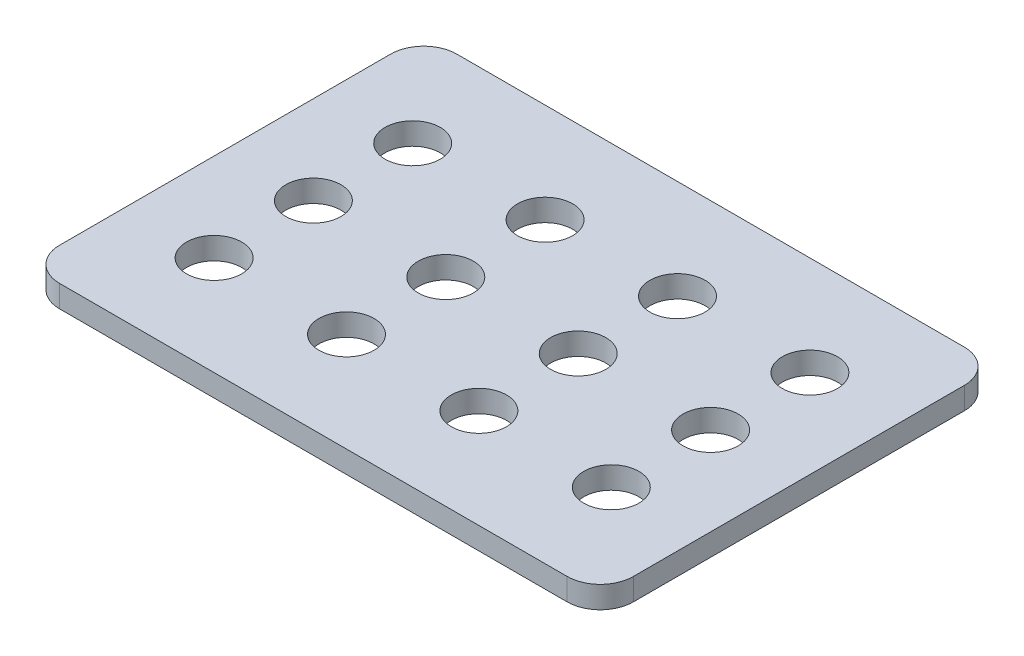
ISO-10303-21;
HEADER;
FILE_DESCRIPTION(('STEP AP214'),'2;1');
FILE_NAME('part.step','',(''),(''),'','','');
FILE_SCHEMA(('AUTOMOTIVE_DESIGN { 1 0 10303 214 1 1 1 1 }'));
ENDSEC;
DATA;
#1=APPLICATION_CONTEXT('core data for automotive mechanical design processes');
#2=APPLICATION_PROTOCOL_DEFINITION('international standard','automotive_design',2000,#1);
#3=PRODUCT_CONTEXT('',#1,'mechanical');
#4=PRODUCT('Part','Part','',(#3));
#5=PRODUCT_RELATED_PRODUCT_CATEGORY('part','',(#4));
#6=PRODUCT_DEFINITION_FORMATION('','',#4);
#7=PRODUCT_DEFINITION_CONTEXT('part definition',#1,'design');
#8=PRODUCT_DEFINITION('design','',#6,#7);
#9=PRODUCT_DEFINITION_SHAPE('','',#8);
#10=(LENGTH_UNIT() NAMED_UNIT(*) SI_UNIT(.MILLI.,.METRE.));
#11=(NAMED_UNIT(*) PLANE_ANGLE_UNIT() SI_UNIT($,.RADIAN.));
#12=(NAMED_UNIT(*) SI_UNIT($,.STERADIAN.) SOLID_ANGLE_UNIT());
#13=UNCERTAINTY_MEASURE_WITH_UNIT(LENGTH_MEASURE(1.E-05),#10,'distance_accuracy_value','');
#14=(GEOMETRIC_REPRESENTATION_CONTEXT(3) GLOBAL_UNCERTAINTY_ASSIGNED_CONTEXT((#13)) GLOBAL_UNIT_ASSIGNED_CONTEXT((#10,
#11,#12)) REPRESENTATION_CONTEXT('',''));
#15=CARTESIAN_POINT('',(0.,0.,0.));
#16=DIRECTION('',(0.,0.,1.));
#17=DIRECTION('',(1.,0.,0.));
#18=AXIS2_PLACEMENT_3D('',#15,#16,#17);
#19=CARTESIAN_POINT('',(15.,-10.,-15.));
#20=DIRECTION('',(0.,1.,0.));
#21=DIRECTION('',(0.,0.,1.));
#22=AXIS2_PLACEMENT_3D('',#19,#20,#21);
#23=CYLINDRICAL_SURFACE('',#22,15.);
#24=CARTESIAN_POINT('',(15.,0.,-15.));
#25=DIRECTION('',(0.,1.,0.));
#26=DIRECTION('',(0.,0.,-1.));
#27=AXIS2_PLACEMENT_3D('',#24,#25,#26);
#28=CIRCLE('',#27,15.);
#29=CARTESIAN_POINT('',(0.,0.,-15.0000000000001));
#30=VERTEX_POINT('',#29);
#31=CARTESIAN_POINT('',(15.0000000000001,0.,0.));
#32=VERTEX_POINT('',#31);
#33=EDGE_CURVE('E138',#30,#32,#28,.T.);
#34=ORIENTED_EDGE('',*,*,#33,.F.);
#35=DIRECTION('',(0.,1.,0.));
#36=VECTOR('',#35,1.);
#37=CARTESIAN_POINT('',(0.,-10.,-15.0000000000001));
#38=LINE('',#37,#36);
#39=CARTESIAN_POINT('',(0.,-10.,-15.0000000000001));
#40=VERTEX_POINT('',#39);
#41=EDGE_CURVE('E11',#40,#30,#38,.T.);
#42=ORIENTED_EDGE('',*,*,#41,.F.);
#43=CARTESIAN_POINT('',(15.,-10.,-15.));
#44=DIRECTION('',(0.,1.,0.));
#45=DIRECTION('',(0.,0.,-1.));
#46=AXIS2_PLACEMENT_3D('',#43,#44,#45);
#47=CIRCLE('',#46,15.);
#48=CARTESIAN_POINT('',(15.0000000000001,-10.,0.));
#49=VERTEX_POINT('',#48);
#50=EDGE_CURVE('E159',#40,#49,#47,.T.);
#51=ORIENTED_EDGE('',*,*,#50,.T.);
#52=DIRECTION('',(0.,1.,0.));
#53=VECTOR('',#52,1.);
#54=CARTESIAN_POINT('',(15.0000000000001,-10.,0.));
#55=LINE('',#54,#53);
#56=EDGE_CURVE('E42',#49,#32,#55,.T.);
#57=ORIENTED_EDGE('',*,*,#56,.T.);
#58=EDGE_LOOP('',(#34,#42,#51,#57));
#59=FACE_BOUND('',#58,.T.);
#60=ADVANCED_FACE('F41',(#59),#23,.T.);
#61=CARTESIAN_POINT('',(0.,-10.,-15.0000000000001));
#62=DIRECTION('',(-1.,0.,0.));
#63=DIRECTION('',(0.,0.,1.));
#64=AXIS2_PLACEMENT_3D('',#61,#62,#63);
#65=PLANE('',#64);
#66=DIRECTION('',(0.,0.,1.));
#67=VECTOR('',#66,1.);
#68=CARTESIAN_POINT('',(0.,0.,-15.0000000000001));
#69=LINE('',#68,#67);
#70=CARTESIAN_POINT('',(0.,0.,-165.));
#71=VERTEX_POINT('',#70);
#72=EDGE_CURVE('E160',#71,#30,#69,.T.);
#73=ORIENTED_EDGE('',*,*,#72,.F.);
#74=DIRECTION('',(0.,1.,0.));
#75=VECTOR('',#74,1.);
#76=CARTESIAN_POINT('',(0.,-10.,-165.));
#77=LINE('',#76,#75);
#78=CARTESIAN_POINT('',(0.,-10.,-165.));
#79=VERTEX_POINT('',#78);
#80=EDGE_CURVE('E49',#79,#71,#77,.T.);
#81=ORIENTED_EDGE('',*,*,#80,.F.);
#82=DIRECTION('',(0.,0.,1.));
#83=VECTOR('',#82,1.);
#84=CARTESIAN_POINT('',(0.,-10.,-15.0000000000001));
#85=LINE('',#84,#83);
#86=EDGE_CURVE('E126',#79,#40,#85,.T.);
#87=ORIENTED_EDGE('',*,*,#86,.T.);
#88=ORIENTED_EDGE('',*,*,#41,.T.);
#89=EDGE_LOOP('',(#73,#81,#87,#88));
#90=FACE_BOUND('',#89,.T.);
#91=ADVANCED_FACE('F173',(#90),#65,.T.);
#92=CARTESIAN_POINT('',(15.,-10.,-165.));
#93=DIRECTION('',(0.,1.,0.));
#94=DIRECTION('',(0.,0.,1.));
#95=AXIS2_PLACEMENT_3D('',#92,#93,#94);
#96=CYLINDRICAL_SURFACE('',#95,15.);
#97=CARTESIAN_POINT('',(15.,0.,-165.));
#98=DIRECTION('',(0.,1.,0.));
#99=DIRECTION('',(0.,0.,-1.));
#100=AXIS2_PLACEMENT_3D('',#97,#98,#99);
#101=CIRCLE('',#100,15.);
#102=CARTESIAN_POINT('',(15.0000000000001,0.,-180.));
#103=VERTEX_POINT('',#102);
#104=EDGE_CURVE('E113',#103,#71,#101,.T.);
#105=ORIENTED_EDGE('',*,*,#104,.F.);
#106=DIRECTION('',(0.,1.,0.));
#107=VECTOR('',#106,1.);
#108=CARTESIAN_POINT('',(15.0000000000001,-10.,-180.));
#109=LINE('',#108,#107);
#110=CARTESIAN_POINT('',(15.0000000000001,-10.,-180.));
#111=VERTEX_POINT('',#110);
#112=EDGE_CURVE('E110',#111,#103,#109,.T.);
#113=ORIENTED_EDGE('',*,*,#112,.F.);
#114=CARTESIAN_POINT('',(15.,-10.,-165.));
#115=DIRECTION('',(0.,1.,0.));
#116=DIRECTION('',(0.,0.,-1.));
#117=AXIS2_PLACEMENT_3D('',#114,#115,#116);
#118=CIRCLE('',#117,15.);
#119=EDGE_CURVE('E111',#111,#79,#118,.T.);
#120=ORIENTED_EDGE('',*,*,#119,.T.);
#121=ORIENTED_EDGE('',*,*,#80,.T.);
#122=EDGE_LOOP('',(#105,#113,#120,#121));
#123=FACE_BOUND('',#122,.T.);
#124=ADVANCED_FACE('F115',(#123),#96,.T.);
#125=CARTESIAN_POINT('',(15.0000000000001,-10.,-180.));
#126=DIRECTION('',(0.,0.,-1.));
#127=DIRECTION('',(-1.,0.,0.));
#128=AXIS2_PLACEMENT_3D('',#125,#126,#127);
#129=PLANE('',#128);
#130=DIRECTION('',(-1.,0.,0.));
#131=VECTOR('',#130,1.);
#132=CARTESIAN_POINT('',(15.0000000000001,0.,-180.));
#133=LINE('',#132,#131);
#134=CARTESIAN_POINT('',(245.,0.,-180.));
#135=VERTEX_POINT('',#134);
#136=EDGE_CURVE('E153',#135,#103,#133,.T.);
#137=ORIENTED_EDGE('',*,*,#136,.F.);
#138=DIRECTION('',(0.,1.,0.));
#139=VECTOR('',#138,1.);
#140=CARTESIAN_POINT('',(245.,-10.,-180.));
#141=LINE('',#140,#139);
#142=CARTESIAN_POINT('',(245.,-10.,-180.));
#143=VERTEX_POINT('',#142);
#144=EDGE_CURVE('E120',#143,#135,#141,.T.);
#145=ORIENTED_EDGE('',*,*,#144,.F.);
#146=DIRECTION('',(-1.,0.,0.));
#147=VECTOR('',#146,1.);
#148=CARTESIAN_POINT('',(15.0000000000001,-10.,-180.));
#149=LINE('',#148,#147);
#150=EDGE_CURVE('E128',#143,#111,#149,.T.);
#151=ORIENTED_EDGE('',*,*,#150,.T.);
#152=ORIENTED_EDGE('',*,*,#112,.T.);
#153=EDGE_LOOP('',(#137,#145,#151,#152));
#154=FACE_BOUND('',#153,.T.);
#155=ADVANCED_FACE('F127',(#154),#129,.T.);
#156=CARTESIAN_POINT('',(245.,-10.,-165.));
#157=DIRECTION('',(0.,1.,0.));
#158=DIRECTION('',(0.,0.,1.));
#159=AXIS2_PLACEMENT_3D('',#156,#157,#158);
#160=CYLINDRICAL_SURFACE('',#159,15.);
#161=CARTESIAN_POINT('',(245.,0.,-165.));
#162=DIRECTION('',(0.,1.,0.));
#163=DIRECTION('',(0.,0.,1.));
#164=AXIS2_PLACEMENT_3D('',#161,#162,#163);
#165=CIRCLE('',#164,15.);
#166=CARTESIAN_POINT('',(260.,0.,-165.));
#167=VERTEX_POINT('',#166);
#168=EDGE_CURVE('E151',#167,#135,#165,.T.);
#169=ORIENTED_EDGE('',*,*,#168,.F.);
#170=DIRECTION('',(0.,1.,0.));
#171=VECTOR('',#170,1.);
#172=CARTESIAN_POINT('',(260.,-10.,-165.));
#173=LINE('',#172,#171);
#174=CARTESIAN_POINT('',(260.,-10.,-165.));
#175=VERTEX_POINT('',#174);
#176=EDGE_CURVE('E164',#175,#167,#173,.T.);
#177=ORIENTED_EDGE('',*,*,#176,.F.);
#178=CARTESIAN_POINT('',(245.,-10.,-165.));
#179=DIRECTION('',(0.,1.,0.));
#180=DIRECTION('',(0.,0.,1.));
#181=AXIS2_PLACEMENT_3D('',#178,#179,#180);
#182=CIRCLE('',#181,15.);
#183=EDGE_CURVE('E131',#175,#143,#182,.T.);
#184=ORIENTED_EDGE('',*,*,#183,.T.);
#185=ORIENTED_EDGE('',*,*,#144,.T.);
#186=EDGE_LOOP('',(#169,#177,#184,#185));
#187=FACE_BOUND('',#186,.T.);
#188=ADVANCED_FACE('F182',(#187),#160,.T.);
#189=CARTESIAN_POINT('',(260.,-10.,-15.0000000000001));
#190=DIRECTION('',(1.,0.,0.));
#191=DIRECTION('',(0.,0.,-1.));
#192=AXIS2_PLACEMENT_3D('',#189,#190,#191);
#193=PLANE('',#192);
#194=DIRECTION('',(0.,0.,-1.));
#195=VECTOR('',#194,1.);
#196=CARTESIAN_POINT('',(260.,0.,-15.0000000000001));
#197=LINE('',#196,#195);
#198=CARTESIAN_POINT('',(260.,0.,-15.0000000000001));
#199=VERTEX_POINT('',#198);
#200=EDGE_CURVE('E149',#199,#167,#197,.T.);
#201=ORIENTED_EDGE('',*,*,#200,.F.);
#202=DIRECTION('',(0.,1.,0.));
#203=VECTOR('',#202,1.);
#204=CARTESIAN_POINT('',(260.,-10.,-15.0000000000001));
#205=LINE('',#204,#203);
#206=CARTESIAN_POINT('',(260.,-10.,-15.0000000000001));
#207=VERTEX_POINT('',#206);
#208=EDGE_CURVE('E165',#207,#199,#205,.T.);
#209=ORIENTED_EDGE('',*,*,#208,.F.);
#210=DIRECTION('',(0.,0.,-1.));
#211=VECTOR('',#210,1.);
#212=CARTESIAN_POINT('',(260.,-10.,-15.0000000000001));
#213=LINE('',#212,#211);
#214=EDGE_CURVE('E133',#207,#175,#213,.T.);
#215=ORIENTED_EDGE('',*,*,#214,.T.);
#216=ORIENTED_EDGE('',*,*,#176,.T.);
#217=EDGE_LOOP('',(#201,#209,#215,#216));
#218=FACE_BOUND('',#217,.T.);
#219=ADVANCED_FACE('F190',(#218),#193,.T.);
#220=CARTESIAN_POINT('',(245.,-10.,-15.));
#221=DIRECTION('',(0.,1.,0.));
#222=DIRECTION('',(0.,0.,1.));
#223=AXIS2_PLACEMENT_3D('',#220,#221,#222);
#224=CYLINDRICAL_SURFACE('',#223,15.);
#225=CARTESIAN_POINT('',(245.,0.,-15.));
#226=DIRECTION('',(0.,1.,0.));
#227=DIRECTION('',(0.,0.,1.));
#228=AXIS2_PLACEMENT_3D('',#225,#226,#227);
#229=CIRCLE('',#228,15.);
#230=CARTESIAN_POINT('',(245.,0.,0.));
#231=VERTEX_POINT('',#230);
#232=EDGE_CURVE('E144',#231,#199,#229,.T.);
#233=ORIENTED_EDGE('',*,*,#232,.F.);
#234=DIRECTION('',(0.,1.,0.));
#235=VECTOR('',#234,1.);
#236=CARTESIAN_POINT('',(245.,-10.,0.));
#237=LINE('',#236,#235);
#238=CARTESIAN_POINT('',(245.,-10.,0.));
#239=VERTEX_POINT('',#238);
#240=EDGE_CURVE('E168',#239,#231,#237,.T.);
#241=ORIENTED_EDGE('',*,*,#240,.F.);
#242=CARTESIAN_POINT('',(245.,-10.,-15.));
#243=DIRECTION('',(0.,1.,0.));
#244=DIRECTION('',(0.,0.,1.));
#245=AXIS2_PLACEMENT_3D('',#242,#243,#244);
#246=CIRCLE('',#245,15.);
#247=EDGE_CURVE('E334',#239,#207,#246,.T.);
#248=ORIENTED_EDGE('',*,*,#247,.T.);
#249=ORIENTED_EDGE('',*,*,#208,.T.);
#250=EDGE_LOOP('',(#233,#241,#248,#249));
#251=FACE_BOUND('',#250,.T.);
#252=ADVANCED_FACE('F192',(#251),#224,.T.);
#253=CARTESIAN_POINT('',(15.0000000000001,-10.,0.));
#254=DIRECTION('',(0.,0.,1.));
#255=DIRECTION('',(1.,0.,0.));
#256=AXIS2_PLACEMENT_3D('',#253,#254,#255);
#257=PLANE('',#256);
#258=DIRECTION('',(1.,0.,0.));
#259=VECTOR('',#258,1.);
#260=CARTESIAN_POINT('',(15.0000000000001,0.,0.));
#261=LINE('',#260,#259);
#262=EDGE_CURVE('E141',#32,#231,#261,.T.);
#263=ORIENTED_EDGE('',*,*,#262,.F.);
#264=ORIENTED_EDGE('',*,*,#56,.F.);
#265=DIRECTION('',(1.,0.,0.));
#266=VECTOR('',#265,1.);
#267=CARTESIAN_POINT('',(15.0000000000001,-10.,0.));
#268=LINE('',#267,#266);
#269=EDGE_CURVE('E331',#49,#239,#268,.T.);
#270=ORIENTED_EDGE('',*,*,#269,.T.);
#271=ORIENTED_EDGE('',*,*,#240,.T.);
#272=EDGE_LOOP('',(#263,#264,#270,#271));
#273=FACE_BOUND('',#272,.T.);
#274=ADVANCED_FACE('F166',(#273),#257,.T.);
#275=CARTESIAN_POINT('',(15.,-10.,-15.));
#276=DIRECTION('',(0.,-1.,0.));
#277=DIRECTION('',(0.,0.,-1.));
#278=AXIS2_PLACEMENT_3D('',#275,#276,#277);
#279=PLANE('',#278);
#280=CARTESIAN_POINT('',(220.,-10.,-135.));
#281=DIRECTION('',(0.,1.,0.));
#282=DIRECTION('',(0.,0.,1.));
#283=AXIS2_PLACEMENT_3D('',#280,#281,#282);
#284=CIRCLE('',#283,12.5);
#285=CARTESIAN_POINT('',(220.,-10.,-122.5));
#286=VERTEX_POINT('',#285);
#287=EDGE_CURVE('E256',#286,#286,#284,.T.);
#288=ORIENTED_EDGE('',*,*,#287,.T.);
#289=EDGE_LOOP('',(#288));
#290=FACE_BOUND('',#289,.T.);
#291=CARTESIAN_POINT('',(220.,-10.,-90.));
#292=DIRECTION('',(0.,1.,0.));
#293=DIRECTION('',(0.,0.,1.));
#294=AXIS2_PLACEMENT_3D('',#291,#292,#293);
#295=CIRCLE('',#294,12.5);
#296=CARTESIAN_POINT('',(220.,-10.,-77.5));
#297=VERTEX_POINT('',#296);
#298=EDGE_CURVE('E266',#297,#297,#295,.T.);
#299=ORIENTED_EDGE('',*,*,#298,.T.);
#300=EDGE_LOOP('',(#299));
#301=FACE_BOUND('',#300,.T.);
#302=CARTESIAN_POINT('',(220.,-10.,-45.));
#303=DIRECTION('',(0.,1.,0.));
#304=DIRECTION('',(0.,0.,1.));
#305=AXIS2_PLACEMENT_3D('',#302,#303,#304);
#306=CIRCLE('',#305,12.5);
#307=CARTESIAN_POINT('',(220.,-10.,-32.5));
#308=VERTEX_POINT('',#307);
#309=EDGE_CURVE('E275',#308,#308,#306,.T.);
#310=ORIENTED_EDGE('',*,*,#309,.T.);
#311=EDGE_LOOP('',(#310));
#312=FACE_BOUND('',#311,.T.);
#313=CARTESIAN_POINT('',(160.,-10.,-135.));
#314=DIRECTION('',(0.,1.,0.));
#315=DIRECTION('',(0.,0.,1.));
#316=AXIS2_PLACEMENT_3D('',#313,#314,#315);
#317=CIRCLE('',#316,12.5);
#318=CARTESIAN_POINT('',(160.,-10.,-122.5));
#319=VERTEX_POINT('',#318);
#320=EDGE_CURVE('E277',#319,#319,#317,.T.);
#321=ORIENTED_EDGE('',*,*,#320,.T.);
#322=EDGE_LOOP('',(#321));
#323=FACE_BOUND('',#322,.T.);
#324=CARTESIAN_POINT('',(160.,-10.,-90.));
#325=DIRECTION('',(0.,1.,0.));
#326=DIRECTION('',(0.,0.,1.));
#327=AXIS2_PLACEMENT_3D('',#324,#325,#326);
#328=CIRCLE('',#327,12.5);
#329=CARTESIAN_POINT('',(160.,-10.,-77.5));
#330=VERTEX_POINT('',#329);
#331=EDGE_CURVE('E281',#330,#330,#328,.T.);
#332=ORIENTED_EDGE('',*,*,#331,.T.);
#333=EDGE_LOOP('',(#332));
#334=FACE_BOUND('',#333,.T.);
#335=CARTESIAN_POINT('',(160.,-10.,-45.));
#336=DIRECTION('',(0.,1.,0.));
#337=DIRECTION('',(0.,0.,1.));
#338=AXIS2_PLACEMENT_3D('',#335,#336,#337);
#339=CIRCLE('',#338,12.5);
#340=CARTESIAN_POINT('',(160.,-10.,-32.5));
#341=VERTEX_POINT('',#340);
#342=EDGE_CURVE('E290',#341,#341,#339,.T.);
#343=ORIENTED_EDGE('',*,*,#342,.T.);
#344=EDGE_LOOP('',(#343));
#345=FACE_BOUND('',#344,.T.);
#346=CARTESIAN_POINT('',(100.,-10.,-135.));
#347=DIRECTION('',(0.,1.,0.));
#348=DIRECTION('',(0.,0.,1.));
#349=AXIS2_PLACEMENT_3D('',#346,#347,#348);
#350=CIRCLE('',#349,12.5);
#351=CARTESIAN_POINT('',(100.,-10.,-122.5));
#352=VERTEX_POINT('',#351);
#353=EDGE_CURVE('E296',#352,#352,#350,.T.);
#354=ORIENTED_EDGE('',*,*,#353,.T.);
#355=EDGE_LOOP('',(#354));
#356=FACE_BOUND('',#355,.T.);
#357=CARTESIAN_POINT('',(100.,-10.,-90.));
#358=DIRECTION('',(0.,1.,0.));
#359=DIRECTION('',(0.,0.,1.));
#360=AXIS2_PLACEMENT_3D('',#357,#358,#359);
#361=CIRCLE('',#360,12.5);
#362=CARTESIAN_POINT('',(100.,-10.,-77.5));
#363=VERTEX_POINT('',#362);
#364=EDGE_CURVE('E302',#363,#363,#361,.T.);
#365=ORIENTED_EDGE('',*,*,#364,.T.);
#366=EDGE_LOOP('',(#365));
#367=FACE_BOUND('',#366,.T.);
#368=CARTESIAN_POINT('',(100.,-10.,-45.));
#369=DIRECTION('',(0.,1.,0.));
#370=DIRECTION('',(0.,0.,1.));
#371=AXIS2_PLACEMENT_3D('',#368,#369,#370);
#372=CIRCLE('',#371,12.5);
#373=CARTESIAN_POINT('',(100.,-10.,-32.5));
#374=VERTEX_POINT('',#373);
#375=EDGE_CURVE('E306',#374,#374,#372,.T.);
#376=ORIENTED_EDGE('',*,*,#375,.T.);
#377=EDGE_LOOP('',(#376));
#378=FACE_BOUND('',#377,.T.);
#379=CARTESIAN_POINT('',(40.,-10.,-135.));
#380=DIRECTION('',(0.,1.,0.));
#381=DIRECTION('',(0.,0.,1.));
#382=AXIS2_PLACEMENT_3D('',#379,#380,#381);
#383=CIRCLE('',#382,12.5);
#384=CARTESIAN_POINT('',(40.,-10.,-122.5));
#385=VERTEX_POINT('',#384);
#386=EDGE_CURVE('E312',#385,#385,#383,.T.);
#387=ORIENTED_EDGE('',*,*,#386,.T.);
#388=EDGE_LOOP('',(#387));
#389=FACE_BOUND('',#388,.T.);
#390=CARTESIAN_POINT('',(40.,-10.,-90.));
#391=DIRECTION('',(0.,1.,0.));
#392=DIRECTION('',(0.,0.,1.));
#393=AXIS2_PLACEMENT_3D('',#390,#391,#392);
#394=CIRCLE('',#393,12.5);
#395=CARTESIAN_POINT('',(40.,-10.,-77.5));
#396=VERTEX_POINT('',#395);
#397=EDGE_CURVE('E319',#396,#396,#394,.T.);
#398=ORIENTED_EDGE('',*,*,#397,.T.);
#399=EDGE_LOOP('',(#398));
#400=FACE_BOUND('',#399,.T.);
#401=CARTESIAN_POINT('',(40.,-10.,-45.));
#402=DIRECTION('',(0.,1.,0.));
#403=DIRECTION('',(0.,0.,1.));
#404=AXIS2_PLACEMENT_3D('',#401,#402,#403);
#405=CIRCLE('',#404,12.5);
#406=CARTESIAN_POINT('',(40.,-10.,-32.5));
#407=VERTEX_POINT('',#406);
#408=EDGE_CURVE('E145',#407,#407,#405,.T.);
#409=ORIENTED_EDGE('',*,*,#408,.T.);
#410=EDGE_LOOP('',(#409));
#411=FACE_BOUND('',#410,.T.);
#412=ORIENTED_EDGE('',*,*,#50,.F.);
#413=ORIENTED_EDGE('',*,*,#86,.F.);
#414=ORIENTED_EDGE('',*,*,#119,.F.);
#415=ORIENTED_EDGE('',*,*,#150,.F.);
#416=ORIENTED_EDGE('',*,*,#183,.F.);
#417=ORIENTED_EDGE('',*,*,#214,.F.);
#418=ORIENTED_EDGE('',*,*,#247,.F.);
#419=ORIENTED_EDGE('',*,*,#269,.F.);
#420=EDGE_LOOP('',(#412,#413,#414,#415,#416,#417,#418,#419));
#421=FACE_BOUND('',#420,.T.);
#422=ADVANCED_FACE('F125',(#290,#301,#312,#323,#334,#345,#356,#367,#378,#389,#400,#411,#421),
#279,.T.);
#423=CARTESIAN_POINT('',(15.,0.,-15.));
#424=DIRECTION('',(0.,-1.,0.));
#425=DIRECTION('',(0.,0.,-1.));
#426=AXIS2_PLACEMENT_3D('',#423,#424,#425);
#427=PLANE('',#426);
#428=CARTESIAN_POINT('',(220.,0.,-135.));
#429=DIRECTION('',(0.,1.,0.));
#430=DIRECTION('',(0.,0.,1.));
#431=AXIS2_PLACEMENT_3D('',#428,#429,#430);
#432=CIRCLE('',#431,12.5);
#433=CARTESIAN_POINT('',(220.,0.,-122.5));
#434=VERTEX_POINT('',#433);
#435=EDGE_CURVE('E263',#434,#434,#432,.T.);
#436=ORIENTED_EDGE('',*,*,#435,.F.);
#437=EDGE_LOOP('',(#436));
#438=FACE_BOUND('',#437,.T.);
#439=CARTESIAN_POINT('',(220.,0.,-90.));
#440=DIRECTION('',(0.,1.,0.));
#441=DIRECTION('',(0.,0.,1.));
#442=AXIS2_PLACEMENT_3D('',#439,#440,#441);
#443=CIRCLE('',#442,12.5);
#444=CARTESIAN_POINT('',(220.,0.,-77.5));
#445=VERTEX_POINT('',#444);
#446=EDGE_CURVE('E261',#445,#445,#443,.T.);
#447=ORIENTED_EDGE('',*,*,#446,.F.);
#448=EDGE_LOOP('',(#447));
#449=FACE_BOUND('',#448,.T.);
#450=CARTESIAN_POINT('',(220.,0.,-45.));
#451=DIRECTION('',(0.,1.,0.));
#452=DIRECTION('',(0.,0.,1.));
#453=AXIS2_PLACEMENT_3D('',#450,#451,#452);
#454=CIRCLE('',#453,12.5);
#455=CARTESIAN_POINT('',(220.,0.,-32.5));
#456=VERTEX_POINT('',#455);
#457=EDGE_CURVE('E267',#456,#456,#454,.T.);
#458=ORIENTED_EDGE('',*,*,#457,.F.);
#459=EDGE_LOOP('',(#458));
#460=FACE_BOUND('',#459,.T.);
#461=CARTESIAN_POINT('',(160.,0.,-135.));
#462=DIRECTION('',(0.,1.,0.));
#463=DIRECTION('',(0.,0.,1.));
#464=AXIS2_PLACEMENT_3D('',#461,#462,#463);
#465=CIRCLE('',#464,12.5);
#466=CARTESIAN_POINT('',(160.,0.,-122.5));
#467=VERTEX_POINT('',#466);
#468=EDGE_CURVE('E274',#467,#467,#465,.T.);
#469=ORIENTED_EDGE('',*,*,#468,.F.);
#470=EDGE_LOOP('',(#469));
#471=FACE_BOUND('',#470,.T.);
#472=CARTESIAN_POINT('',(160.,0.,-90.));
#473=DIRECTION('',(0.,1.,0.));
#474=DIRECTION('',(0.,0.,1.));
#475=AXIS2_PLACEMENT_3D('',#472,#473,#474);
#476=CIRCLE('',#475,12.5);
#477=CARTESIAN_POINT('',(160.,0.,-77.5));
#478=VERTEX_POINT('',#477);
#479=EDGE_CURVE('E282',#478,#478,#476,.T.);
#480=ORIENTED_EDGE('',*,*,#479,.F.);
#481=EDGE_LOOP('',(#480));
#482=FACE_BOUND('',#481,.T.);
#483=CARTESIAN_POINT('',(160.,0.,-45.));
#484=DIRECTION('',(0.,1.,0.));
#485=DIRECTION('',(0.,0.,1.));
#486=AXIS2_PLACEMENT_3D('',#483,#484,#485);
#487=CIRCLE('',#486,12.5);
#488=CARTESIAN_POINT('',(160.,0.,-32.5));
#489=VERTEX_POINT('',#488);
#490=EDGE_CURVE('E287',#489,#489,#487,.T.);
#491=ORIENTED_EDGE('',*,*,#490,.F.);
#492=EDGE_LOOP('',(#491));
#493=FACE_BOUND('',#492,.T.);
#494=CARTESIAN_POINT('',(100.,0.,-135.));
#495=DIRECTION('',(0.,1.,0.));
#496=DIRECTION('',(0.,0.,1.));
#497=AXIS2_PLACEMENT_3D('',#494,#495,#496);
#498=CIRCLE('',#497,12.5);
#499=CARTESIAN_POINT('',(100.,0.,-122.5));
#500=VERTEX_POINT('',#499);
#501=EDGE_CURVE('E291',#500,#500,#498,.T.);
#502=ORIENTED_EDGE('',*,*,#501,.F.);
#503=EDGE_LOOP('',(#502));
#504=FACE_BOUND('',#503,.T.);
#505=CARTESIAN_POINT('',(100.,0.,-90.));
#506=DIRECTION('',(0.,1.,0.));
#507=DIRECTION('',(0.,0.,1.));
#508=AXIS2_PLACEMENT_3D('',#505,#506,#507);
#509=CIRCLE('',#508,12.5);
#510=CARTESIAN_POINT('',(100.,0.,-77.5));
#511=VERTEX_POINT('',#510);
#512=EDGE_CURVE('E298',#511,#511,#509,.T.);
#513=ORIENTED_EDGE('',*,*,#512,.F.);
#514=EDGE_LOOP('',(#513));
#515=FACE_BOUND('',#514,.T.);
#516=CARTESIAN_POINT('',(100.,0.,-45.));
#517=DIRECTION('',(0.,1.,0.));
#518=DIRECTION('',(0.,0.,1.));
#519=AXIS2_PLACEMENT_3D('',#516,#517,#518);
#520=CIRCLE('',#519,12.5);
#521=CARTESIAN_POINT('',(100.,0.,-32.5));
#522=VERTEX_POINT('',#521);
#523=EDGE_CURVE('E304',#522,#522,#520,.T.);
#524=ORIENTED_EDGE('',*,*,#523,.F.);
#525=EDGE_LOOP('',(#524));
#526=FACE_BOUND('',#525,.T.);
#527=CARTESIAN_POINT('',(40.,0.,-135.));
#528=DIRECTION('',(0.,1.,0.));
#529=DIRECTION('',(0.,0.,1.));
#530=AXIS2_PLACEMENT_3D('',#527,#528,#529);
#531=CIRCLE('',#530,12.5);
#532=CARTESIAN_POINT('',(40.,0.,-122.5));
#533=VERTEX_POINT('',#532);
#534=EDGE_CURVE('E311',#533,#533,#531,.T.);
#535=ORIENTED_EDGE('',*,*,#534,.F.);
#536=EDGE_LOOP('',(#535));
#537=FACE_BOUND('',#536,.T.);
#538=CARTESIAN_POINT('',(40.,0.,-90.));
#539=DIRECTION('',(0.,1.,0.));
#540=DIRECTION('',(0.,0.,1.));
#541=AXIS2_PLACEMENT_3D('',#538,#539,#540);
#542=CIRCLE('',#541,12.5);
#543=CARTESIAN_POINT('',(40.,0.,-77.5));
#544=VERTEX_POINT('',#543);
#545=EDGE_CURVE('E320',#544,#544,#542,.T.);
#546=ORIENTED_EDGE('',*,*,#545,.F.);
#547=EDGE_LOOP('',(#546));
#548=FACE_BOUND('',#547,.T.);
#549=CARTESIAN_POINT('',(40.,0.,-45.));
#550=DIRECTION('',(0.,1.,0.));
#551=DIRECTION('',(0.,0.,1.));
#552=AXIS2_PLACEMENT_3D('',#549,#550,#551);
#553=CIRCLE('',#552,12.5);
#554=CARTESIAN_POINT('',(40.,0.,-32.5));
#555=VERTEX_POINT('',#554);
#556=EDGE_CURVE('E322',#555,#555,#553,.T.);
#557=ORIENTED_EDGE('',*,*,#556,.F.);
#558=EDGE_LOOP('',(#557));
#559=FACE_BOUND('',#558,.T.);
#560=ORIENTED_EDGE('',*,*,#33,.T.);
#561=ORIENTED_EDGE('',*,*,#262,.T.);
#562=ORIENTED_EDGE('',*,*,#232,.T.);
#563=ORIENTED_EDGE('',*,*,#200,.T.);
#564=ORIENTED_EDGE('',*,*,#168,.T.);
#565=ORIENTED_EDGE('',*,*,#136,.T.);
#566=ORIENTED_EDGE('',*,*,#104,.T.);
#567=ORIENTED_EDGE('',*,*,#72,.T.);
#568=EDGE_LOOP('',(#560,#561,#562,#563,#564,#565,#566,#567));
#569=FACE_BOUND('',#568,.T.);
#570=ADVANCED_FACE('F169',(#438,#449,#460,#471,#482,#493,#504,#515,#526,#537,#548,#559,#569),
#427,.F.);
#571=CARTESIAN_POINT('',(40.,-10.,-45.));
#572=DIRECTION('',(0.,1.,0.));
#573=DIRECTION('',(0.,0.,1.));
#574=AXIS2_PLACEMENT_3D('',#571,#572,#573);
#575=CYLINDRICAL_SURFACE('',#574,12.5);
#576=ORIENTED_EDGE('',*,*,#408,.F.);
#577=EDGE_LOOP('',(#576));
#578=FACE_BOUND('',#577,.T.);
#579=ORIENTED_EDGE('',*,*,#556,.T.);
#580=EDGE_LOOP('',(#579));
#581=FACE_BOUND('',#580,.T.);
#582=ADVANCED_FACE('F201',(#578,#581),#575,.F.);
#583=CARTESIAN_POINT('',(40.,-10.,-90.));
#584=DIRECTION('',(0.,1.,0.));
#585=DIRECTION('',(0.,0.,1.));
#586=AXIS2_PLACEMENT_3D('',#583,#584,#585);
#587=CYLINDRICAL_SURFACE('',#586,12.5);
#588=ORIENTED_EDGE('',*,*,#397,.F.);
#589=EDGE_LOOP('',(#588));
#590=FACE_BOUND('',#589,.T.);
#591=ORIENTED_EDGE('',*,*,#545,.T.);
#592=EDGE_LOOP('',(#591));
#593=FACE_BOUND('',#592,.T.);
#594=ADVANCED_FACE('F210',(#590,#593),#587,.F.);
#595=CARTESIAN_POINT('',(40.,-10.,-135.));
#596=DIRECTION('',(0.,1.,0.));
#597=DIRECTION('',(0.,0.,1.));
#598=AXIS2_PLACEMENT_3D('',#595,#596,#597);
#599=CYLINDRICAL_SURFACE('',#598,12.5);
#600=ORIENTED_EDGE('',*,*,#386,.F.);
#601=EDGE_LOOP('',(#600));
#602=FACE_BOUND('',#601,.T.);
#603=ORIENTED_EDGE('',*,*,#534,.T.);
#604=EDGE_LOOP('',(#603));
#605=FACE_BOUND('',#604,.T.);
#606=ADVANCED_FACE('F215',(#602,#605),#599,.F.);
#607=CARTESIAN_POINT('',(100.,-10.,-45.));
#608=DIRECTION('',(0.,1.,0.));
#609=DIRECTION('',(0.,0.,1.));
#610=AXIS2_PLACEMENT_3D('',#607,#608,#609);
#611=CYLINDRICAL_SURFACE('',#610,12.5);
#612=ORIENTED_EDGE('',*,*,#375,.F.);
#613=EDGE_LOOP('',(#612));
#614=FACE_BOUND('',#613,.T.);
#615=ORIENTED_EDGE('',*,*,#523,.T.);
#616=EDGE_LOOP('',(#615));
#617=FACE_BOUND('',#616,.T.);
#618=ADVANCED_FACE('F216',(#614,#617),#611,.F.);
#619=CARTESIAN_POINT('',(100.,-10.,-90.));
#620=DIRECTION('',(0.,1.,0.));
#621=DIRECTION('',(0.,0.,1.));
#622=AXIS2_PLACEMENT_3D('',#619,#620,#621);
#623=CYLINDRICAL_SURFACE('',#622,12.5);
#624=ORIENTED_EDGE('',*,*,#364,.F.);
#625=EDGE_LOOP('',(#624));
#626=FACE_BOUND('',#625,.T.);
#627=ORIENTED_EDGE('',*,*,#512,.T.);
#628=EDGE_LOOP('',(#627));
#629=FACE_BOUND('',#628,.T.);
#630=ADVANCED_FACE('F225',(#626,#629),#623,.F.);
#631=CARTESIAN_POINT('',(100.,-10.,-135.));
#632=DIRECTION('',(0.,1.,0.));
#633=DIRECTION('',(0.,0.,1.));
#634=AXIS2_PLACEMENT_3D('',#631,#632,#633);
#635=CYLINDRICAL_SURFACE('',#634,12.5);
#636=ORIENTED_EDGE('',*,*,#353,.F.);
#637=EDGE_LOOP('',(#636));
#638=FACE_BOUND('',#637,.T.);
#639=ORIENTED_EDGE('',*,*,#501,.T.);
#640=EDGE_LOOP('',(#639));
#641=FACE_BOUND('',#640,.T.);
#642=ADVANCED_FACE('F226',(#638,#641),#635,.F.);
#643=CARTESIAN_POINT('',(160.,-10.,-45.));
#644=DIRECTION('',(0.,1.,0.));
#645=DIRECTION('',(0.,0.,1.));
#646=AXIS2_PLACEMENT_3D('',#643,#644,#645);
#647=CYLINDRICAL_SURFACE('',#646,12.5);
#648=ORIENTED_EDGE('',*,*,#342,.F.);
#649=EDGE_LOOP('',(#648));
#650=FACE_BOUND('',#649,.T.);
#651=ORIENTED_EDGE('',*,*,#490,.T.);
#652=EDGE_LOOP('',(#651));
#653=FACE_BOUND('',#652,.T.);
#654=ADVANCED_FACE('F229',(#650,#653),#647,.F.);
#655=CARTESIAN_POINT('',(160.,-10.,-90.));
#656=DIRECTION('',(0.,1.,0.));
#657=DIRECTION('',(0.,0.,1.));
#658=AXIS2_PLACEMENT_3D('',#655,#656,#657);
#659=CYLINDRICAL_SURFACE('',#658,12.5);
#660=ORIENTED_EDGE('',*,*,#331,.F.);
#661=EDGE_LOOP('',(#660));
#662=FACE_BOUND('',#661,.T.);
#663=ORIENTED_EDGE('',*,*,#479,.T.);
#664=EDGE_LOOP('',(#663));
#665=FACE_BOUND('',#664,.T.);
#666=ADVANCED_FACE('F233',(#662,#665),#659,.F.);
#667=CARTESIAN_POINT('',(160.,-10.,-135.));
#668=DIRECTION('',(0.,1.,0.));
#669=DIRECTION('',(0.,0.,1.));
#670=AXIS2_PLACEMENT_3D('',#667,#668,#669);
#671=CYLINDRICAL_SURFACE('',#670,12.5);
#672=ORIENTED_EDGE('',*,*,#320,.F.);
#673=EDGE_LOOP('',(#672));
#674=FACE_BOUND('',#673,.T.);
#675=ORIENTED_EDGE('',*,*,#468,.T.);
#676=EDGE_LOOP('',(#675));
#677=FACE_BOUND('',#676,.T.);
#678=ADVANCED_FACE('F239',(#674,#677),#671,.F.);
#679=CARTESIAN_POINT('',(220.,-10.,-45.));
#680=DIRECTION('',(0.,1.,0.));
#681=DIRECTION('',(0.,0.,1.));
#682=AXIS2_PLACEMENT_3D('',#679,#680,#681);
#683=CYLINDRICAL_SURFACE('',#682,12.5);
#684=ORIENTED_EDGE('',*,*,#309,.F.);
#685=EDGE_LOOP('',(#684));
#686=FACE_BOUND('',#685,.T.);
#687=ORIENTED_EDGE('',*,*,#457,.T.);
#688=EDGE_LOOP('',(#687));
#689=FACE_BOUND('',#688,.T.);
#690=ADVANCED_FACE('F242',(#686,#689),#683,.F.);
#691=CARTESIAN_POINT('',(220.,-10.,-90.));
#692=DIRECTION('',(0.,1.,0.));
#693=DIRECTION('',(0.,0.,1.));
#694=AXIS2_PLACEMENT_3D('',#691,#692,#693);
#695=CYLINDRICAL_SURFACE('',#694,12.5);
#696=ORIENTED_EDGE('',*,*,#298,.F.);
#697=EDGE_LOOP('',(#696));
#698=FACE_BOUND('',#697,.T.);
#699=ORIENTED_EDGE('',*,*,#446,.T.);
#700=EDGE_LOOP('',(#699));
#701=FACE_BOUND('',#700,.T.);
#702=ADVANCED_FACE('F247',(#698,#701),#695,.F.);
#703=CARTESIAN_POINT('',(220.,-10.,-135.));
#704=DIRECTION('',(0.,1.,0.));
#705=DIRECTION('',(0.,0.,1.));
#706=AXIS2_PLACEMENT_3D('',#703,#704,#705);
#707=CYLINDRICAL_SURFACE('',#706,12.5);
#708=ORIENTED_EDGE('',*,*,#287,.F.);
#709=EDGE_LOOP('',(#708));
#710=FACE_BOUND('',#709,.T.);
#711=ORIENTED_EDGE('',*,*,#435,.T.);
#712=EDGE_LOOP('',(#711));
#713=FACE_BOUND('',#712,.T.);
#714=ADVANCED_FACE('F248',(#710,#713),#707,.F.);
#715=CLOSED_SHELL('',(#60,#91,#124,#155,#188,#219,#252,#274,#422,#570,#582,#594,#606,#618,#630,
#642,#654,#666,#678,#690,#702,#714));
#716=MANIFOLD_SOLID_BREP('B2',#715);
#717=ADVANCED_BREP_SHAPE_REPRESENTATION('',(#18,#716),#14);
#718=SHAPE_DEFINITION_REPRESENTATION(#9,#717);
ENDSEC;
END-ISO-10303-21;
